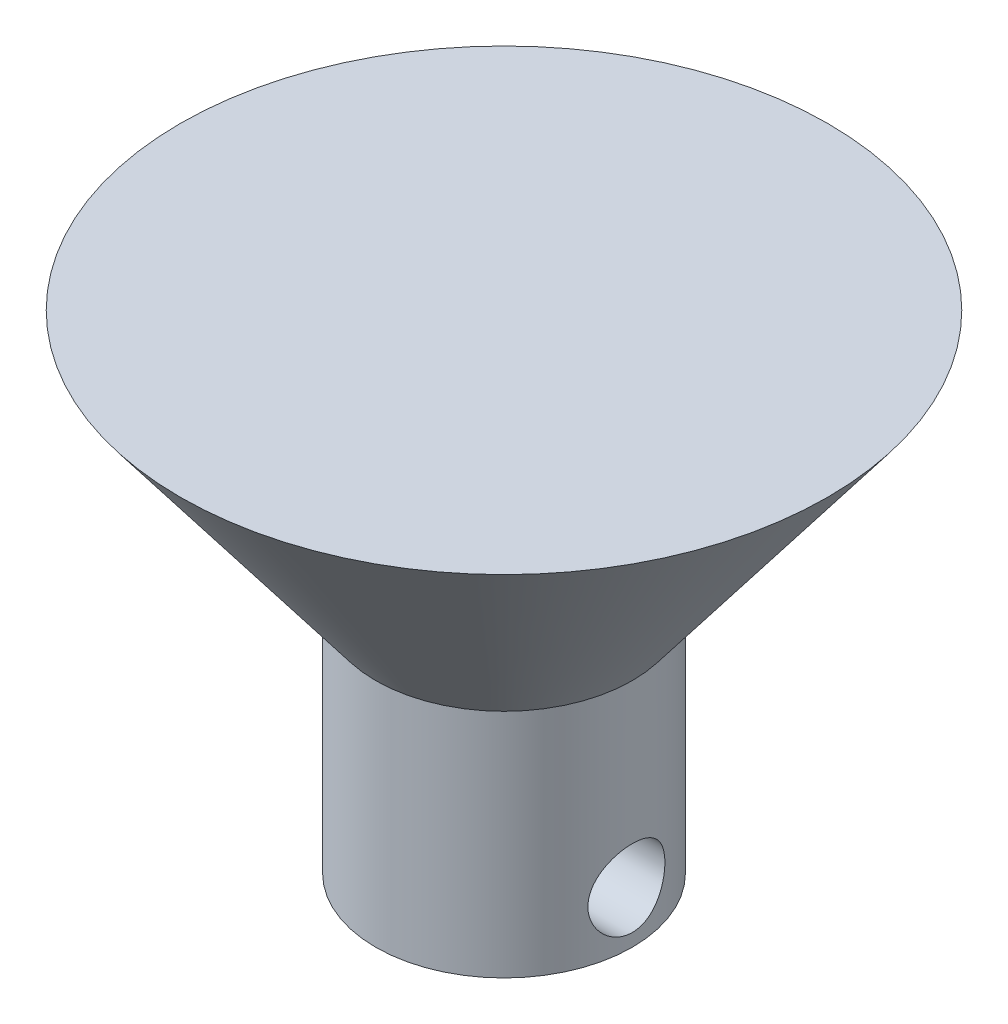
ISO-10303-21;
HEADER;
FILE_DESCRIPTION(('STEP AP214'),'2;1');
FILE_NAME('part.step','',(''),(''),'','','');
FILE_SCHEMA(('AUTOMOTIVE_DESIGN { 1 0 10303 214 1 1 1 1 }'));
ENDSEC;
DATA;
#1=APPLICATION_CONTEXT('core data for automotive mechanical design processes');
#2=APPLICATION_PROTOCOL_DEFINITION('international standard','automotive_design',2000,#1);
#3=PRODUCT_CONTEXT('',#1,'mechanical');
#4=PRODUCT('Part','Part','',(#3));
#5=PRODUCT_RELATED_PRODUCT_CATEGORY('part','',(#4));
#6=PRODUCT_DEFINITION_FORMATION('','',#4);
#7=PRODUCT_DEFINITION_CONTEXT('part definition',#1,'design');
#8=PRODUCT_DEFINITION('design','',#6,#7);
#9=PRODUCT_DEFINITION_SHAPE('','',#8);
#10=(LENGTH_UNIT() NAMED_UNIT(*) SI_UNIT(.MILLI.,.METRE.));
#11=(NAMED_UNIT(*) PLANE_ANGLE_UNIT() SI_UNIT($,.RADIAN.));
#12=(NAMED_UNIT(*) SI_UNIT($,.STERADIAN.) SOLID_ANGLE_UNIT());
#13=UNCERTAINTY_MEASURE_WITH_UNIT(LENGTH_MEASURE(1.E-05),#10,'distance_accuracy_value','');
#14=(GEOMETRIC_REPRESENTATION_CONTEXT(3) GLOBAL_UNCERTAINTY_ASSIGNED_CONTEXT((#13)) GLOBAL_UNIT_ASSIGNED_CONTEXT((#10,
#11,#12)) REPRESENTATION_CONTEXT('',''));
#15=CARTESIAN_POINT('',(0.,0.,0.));
#16=DIRECTION('',(0.,0.,1.));
#17=DIRECTION('',(1.,0.,0.));
#18=AXIS2_PLACEMENT_3D('',#15,#16,#17);
#19=CARTESIAN_POINT('',(0.,9.,0.));
#20=DIRECTION('',(0.,-1.,0.));
#21=DIRECTION('',(0.,0.,-1.));
#22=AXIS2_PLACEMENT_3D('',#19,#20,#21);
#23=CYLINDRICAL_SURFACE('',#22,5.);
#24=CARTESIAN_POINT('',(-5.,0.5,0.));
#25=CARTESIAN_POINT('',(-4.9999992925055,0.500000997484886,-0.0822886127533));
#26=CARTESIAN_POINT('',(-4.99794915693954,0.506793863623966,-0.164587318351529));
#27=CARTESIAN_POINT('',(-4.98997105593691,0.533721354222101,-0.326788125304881));
#28=CARTESIAN_POINT('',(-4.98404193389692,0.553859958023342,-0.40668950441142));
#29=CARTESIAN_POINT('',(-4.96895552501836,0.606746016910264,-0.561732707754527));
#30=CARTESIAN_POINT('',(-4.95980300250425,0.639474869618937,-0.636881364395373));
#31=CARTESIAN_POINT('',(-4.93922109237645,0.716536093055836,-0.780624181053131));
#32=CARTESIAN_POINT('',(-4.92779140192067,0.760870007395417,-0.84921746746967));
#33=CARTESIAN_POINT('',(-4.90350737192774,0.861224007472669,-0.979871797183745));
#34=CARTESIAN_POINT('',(-4.89062383657036,0.917516625885914,-1.04171807124434));
#35=CARTESIAN_POINT('',(-4.86505834210442,1.03960922991018,-1.15524920923324));
#36=CARTESIAN_POINT('',(-4.85237641724501,1.10541081212496,-1.20693236327441));
#37=CARTESIAN_POINT('',(-4.82834113993772,1.24647075303761,-1.29980037723708));
#38=CARTESIAN_POINT('',(-4.81702406663875,1.32190846099074,-1.34072309022213));
#39=CARTESIAN_POINT('',(-4.79743620394031,1.47898925423029,-1.4092139477476));
#40=CARTESIAN_POINT('',(-4.78916468313311,1.56063084392798,-1.43678529919973));
#41=CARTESIAN_POINT('',(-4.77690870838434,1.72539026613046,-1.47701633682652));
#42=CARTESIAN_POINT('',(-4.77281069324533,1.80840274386394,-1.49007196234677));
#43=CARTESIAN_POINT('',(-4.76902789749767,1.97553315621677,-1.50213730614672));
#44=CARTESIAN_POINT('',(-4.76934204760571,2.05965081805909,-1.50115042761078));
#45=CARTESIAN_POINT('',(-4.77424744067778,2.22338390860848,-1.48546977199812));
#46=CARTESIAN_POINT('',(-4.7786838859914,2.30305225036224,-1.47127205262685));
#47=CARTESIAN_POINT('',(-4.79108356228624,2.45881978627346,-1.43037420427056));
#48=CARTESIAN_POINT('',(-4.79904714132351,2.53491862737433,-1.40367284141641));
#49=CARTESIAN_POINT('',(-4.81772733074973,2.68260034966074,-1.33816026653682));
#50=CARTESIAN_POINT('',(-4.82848016115952,2.75410708395526,-1.29918816934642));
#51=CARTESIAN_POINT('',(-4.85150987000065,2.88973202201019,-1.21035222588683));
#52=CARTESIAN_POINT('',(-4.86378711746991,2.95384842941378,-1.16048574002588));
#53=CARTESIAN_POINT('',(-4.88911011297937,3.07568619076202,-1.04881290765546));
#54=CARTESIAN_POINT('',(-4.90216654310498,3.13302866402967,-0.986594907466972));
#55=CARTESIAN_POINT('',(-4.92712244063259,3.23655398406425,-0.853263259313967));
#56=CARTESIAN_POINT('',(-4.9390218351841,3.28273612841443,-0.782149051860888));
#57=CARTESIAN_POINT('',(-4.9604316006947,3.36285992246473,-0.632355038342803));
#58=CARTESIAN_POINT('',(-4.96992543668314,3.39671751624986,-0.55362774974795));
#59=CARTESIAN_POINT('',(-4.98533521832222,3.45059959009963,-0.39124541560352));
#60=CARTESIAN_POINT('',(-4.99125216186999,3.47062792853249,-0.307591751589582));
#61=CARTESIAN_POINT('',(-4.99868364643538,3.49565217789939,-0.140952242668332));
#62=CARTESIAN_POINT('',(-5.0003485041779,3.50116158580161,-0.0580500976011871));
#63=CARTESIAN_POINT('',(-4.9995292324176,3.49843084428792,0.107499605823383));
#64=CARTESIAN_POINT('',(-4.99704565677756,3.49019253034856,0.19014719669078));
#65=CARTESIAN_POINT('',(-4.98830696987163,3.4606153888885,0.350903605309697));
#66=CARTESIAN_POINT('',(-4.98213829799417,3.43957661241913,0.429072772614169));
#67=CARTESIAN_POINT('',(-4.96674347841533,3.3853567672218,0.580754638954522));
#68=CARTESIAN_POINT('',(-4.95751696321085,3.35217423896214,0.654266777025583));
#69=CARTESIAN_POINT('',(-4.93669654351325,3.27374683451887,0.796437189461052));
#70=CARTESIAN_POINT('',(-4.92505280829675,3.22824065905203,0.864943826199669));
#71=CARTESIAN_POINT('',(-4.90073468764318,3.12677524594719,0.993523307980147));
#72=CARTESIAN_POINT('',(-4.8880600443108,3.07081338811233,1.05359403235593));
#73=CARTESIAN_POINT('',(-4.86253171869138,2.94761269163066,1.16585744551027));
#74=CARTESIAN_POINT('',(-4.84968825033268,2.88003812422826,1.21768481231503));
#75=CARTESIAN_POINT('',(-4.82576515238464,2.73687206098647,1.30928995072154));
#76=CARTESIAN_POINT('',(-4.81468547654651,2.66128077544179,1.34906803829472));
#77=CARTESIAN_POINT('',(-4.79567189615055,2.50446750874531,1.41517347127168));
#78=CARTESIAN_POINT('',(-4.78772337843827,2.42327381346341,1.4415634693705));
#79=CARTESIAN_POINT('',(-4.77591594362794,2.25731203106852,1.48021730815114));
#80=CARTESIAN_POINT('',(-4.772055625083,2.17254517921233,1.49248598978779));
#81=CARTESIAN_POINT('',(-4.76899972496087,2.00563848162377,1.50221984485059));
#82=CARTESIAN_POINT('',(-4.76961647442754,1.92353634898242,1.5002805530849));
#83=CARTESIAN_POINT('',(-4.77499401288294,1.7608858966272,1.48307505444813));
#84=CARTESIAN_POINT('',(-4.77975463592551,1.68033751482365,1.46780938124716));
#85=CARTESIAN_POINT('',(-4.79275763670385,1.52405460085715,1.42476888804136));
#86=CARTESIAN_POINT('',(-4.80095604545965,1.44827271263831,1.39715175507068));
#87=CARTESIAN_POINT('',(-4.81990278909136,1.30235756118228,1.33031507121129));
#88=CARTESIAN_POINT('',(-4.83065161194312,1.23222538235924,1.29109329962876));
#89=CARTESIAN_POINT('',(-4.85397676425833,1.09683688347289,1.20048763805072));
#90=CARTESIAN_POINT('',(-4.86660540163798,1.03185123873959,1.14871276092994));
#91=CARTESIAN_POINT('',(-4.89201320450026,0.911297501692137,1.03517434629782));
#92=CARTESIAN_POINT('',(-4.90479240823905,0.855731860532243,0.973408217134502));
#93=CARTESIAN_POINT('',(-4.92950936570649,0.75397658770497,0.839465762183249));
#94=CARTESIAN_POINT('',(-4.94141159765674,0.708108553144511,0.767037885790608));
#95=CARTESIAN_POINT('',(-4.96260680455813,0.629264830095975,0.615141373983529));
#96=CARTESIAN_POINT('',(-4.97190099931067,0.596283111725492,0.535676052998955));
#97=CARTESIAN_POINT('',(-4.98602174969301,0.547104724347251,0.380757712655282));
#98=CARTESIAN_POINT('',(-4.99122027381068,0.529488327116752,0.305786961954234));
#99=CARTESIAN_POINT('',(-4.99820944494492,0.505936474758423,0.15388019523078));
#100=CARTESIAN_POINT('',(-5.0000006615474,0.499999067295181,0.0769445098581397));
#101=CARTESIAN_POINT('',(-5.,0.5,0.));
#102=B_SPLINE_CURVE_WITH_KNOTS('',3,(#24,#25,#26,#27,#28,#29,#30,#31,#32,#33,#34,#35,#36,#37,
#38,#39,#40,#41,#42,#43,#44,#45,#46,#47,#48,#49,#50,#51,#52,#53,#54,#55,#56,#57,#58,#59,#60,#61,
#62,#63,#64,#65,#66,#67,#68,#69,#70,#71,#72,#73,#74,#75,#76,#77,#78,#79,#80,#81,#82,#83,#84,#85,
#86,#87,#88,#89,#90,#91,#92,#93,#94,#95,#96,#97,#98,#99,#100,#101),.UNSPECIFIED.,.T.,.F.,(4,2,2,
2,2,2,2,2,2,2,2,2,2,2,2,2,2,2,2,2,2,2,2,2,2,2,2,2,2,2,2,2,2,2,2,2,2,2,4),(0.,0.246583203612611,
0.493239964846,0.739533676300874,0.985860164412702,1.23855602948191,1.49129437288633,
1.74971481004109,2.00807314543224,2.25919689356599,2.51025978319089,2.75226016697676,
2.99428443658001,3.23962426447119,3.48502360158555,3.74067104048166,3.99633456531071,
4.25371046881688,4.51101453528808,4.75908809438545,5.00712853550327,5.24956746682327,
5.49203554593728,5.74011305702908,5.98825282000191,6.24540400322818,6.5025484425268,
6.75847814951252,7.01432009460283,7.25950155466943,7.504673196616,7.74680040402721,
7.98897397553107,8.23996925679931,8.49102974897502,8.74942996156671,9.00770911595235,
9.23831691930459,9.46888616948874),.UNSPECIFIED.);
#103=CARTESIAN_POINT('',(-5.,0.5,0.));
#104=VERTEX_POINT('',#103);
#105=EDGE_CURVE('E11',#104,#104,#102,.T.);
#106=ORIENTED_EDGE('',*,*,#105,.T.);
#107=EDGE_LOOP('',(#106));
#108=FACE_BOUND('',#107,.T.);
#109=CARTESIAN_POINT('',(4.76969600708473,2.,-1.5));
#110=CARTESIAN_POINT('',(4.7696968572698,1.9178054520576,-1.49999897633764));
#111=CARTESIAN_POINT('',(4.77184390209069,1.83560077585598,-1.49322108167142));
#112=CARTESIAN_POINT('',(4.780165783029,1.67359475040806,-1.46635844446749));
#113=CARTESIAN_POINT('',(4.78634196493468,1.59379421349853,-1.44626925573578));
#114=CARTESIAN_POINT('',(4.80196102485632,1.43896527172827,-1.39352753269955));
#115=CARTESIAN_POINT('',(4.81139846703232,1.36392917036691,-1.36089589394243));
#116=CARTESIAN_POINT('',(4.83246932547567,1.2203780660047,-1.28406421917929));
#117=CARTESIAN_POINT('',(4.84410307041019,1.15186404131556,-1.23986245137053));
#118=CARTESIAN_POINT('',(4.86866862185765,1.02113360942262,-1.13964754141627));
#119=CARTESIAN_POINT('',(4.88162808311636,0.959154102053713,-1.08333207175807));
#120=CARTESIAN_POINT('',(4.90714861936757,0.845362048677491,-0.961136237579599));
#121=CARTESIAN_POINT('',(4.91970964297705,0.793550809550121,-0.895254645461111));
#122=CARTESIAN_POINT('',(4.94333214579389,0.700537300166693,-0.75411143779369));
#123=CARTESIAN_POINT('',(4.95435724342404,0.659576575557191,-0.678684021335815));
#124=CARTESIAN_POINT('',(4.97334435920684,0.591012740957243,-0.521624645369354));
#125=CARTESIAN_POINT('',(4.98130703789495,0.563406750142551,-0.439994028387912));
#126=CARTESIAN_POINT('',(4.99307646003589,0.523119998909491,-0.27532385263083));
#127=CARTESIAN_POINT('',(4.99699557369338,0.510034872347297,-0.192391398953801));
#128=CARTESIAN_POINT('',(5.00063201501348,0.497882675353559,-0.025421823749315));
#129=CARTESIAN_POINT('',(5.00035022521079,0.498812660598037,0.0586150620503682));
#130=CARTESIAN_POINT('',(4.99569603817659,0.514392868543023,0.22257115660016));
#131=CARTESIAN_POINT('',(4.9914542020526,0.528605193809869,0.302536267641341));
#132=CARTESIAN_POINT('',(4.97951522112593,0.56963133599429,0.458889213442527));
#133=CARTESIAN_POINT('',(4.97181785750586,0.596445950942671,0.535276821322846));
#134=CARTESIAN_POINT('',(4.95365220986963,0.662212023418558,0.683347326351281));
#135=CARTESIAN_POINT('',(4.94315269676706,0.701301202807267,0.754965064694478));
#136=CARTESIAN_POINT('',(4.92049640648069,0.790397852428228,0.890764673783156));
#137=CARTESIAN_POINT('',(4.90833923637778,0.840407912963484,0.954944774872131));
#138=CARTESIAN_POINT('',(4.88311550488165,0.952197750751597,1.0766604815298));
#139=CARTESIAN_POINT('',(4.87003195321461,1.01435691902974,1.13384458040111));
#140=CARTESIAN_POINT('',(4.84483979887497,1.14751001789005,1.23707651539824));
#141=CARTESIAN_POINT('',(4.8327312931702,1.21850482538923,1.28312324482853));
#142=CARTESIAN_POINT('',(4.81077903197678,1.36823946924899,1.3631399533545));
#143=CARTESIAN_POINT('',(4.80095810695957,1.44704704586292,1.39698989237679));
#144=CARTESIAN_POINT('',(4.78496392548436,1.60960720844554,1.45083362878413));
#145=CARTESIAN_POINT('',(4.7787894791583,1.69335817153456,1.4708319464056));
#146=CARTESIAN_POINT('',(4.77104849541241,1.86008236073928,1.49574770282165));
#147=CARTESIAN_POINT('',(4.7693187867044,1.94296822389398,1.50119946380212));
#148=CARTESIAN_POINT('',(4.77021192441924,2.10847290000987,1.49835947233062));
#149=CARTESIAN_POINT('',(4.77283416156589,2.19109174873085,1.4900696437133));
#150=CARTESIAN_POINT('',(4.78197558554912,2.35148837797087,1.4604576357419));
#151=CARTESIAN_POINT('',(4.78839176507489,2.42933616426352,1.4394796143128));
#152=CARTESIAN_POINT('',(4.80429141231227,2.58040169081492,1.3854857774794));
#153=CARTESIAN_POINT('',(4.81377535359073,2.65361871414057,1.3524681034276));
#154=CARTESIAN_POINT('',(4.83505835023047,2.79551746407213,1.274318711965));
#155=CARTESIAN_POINT('',(4.84691271069799,2.86402472098579,1.22888564172729));
#156=CARTESIAN_POINT('',(4.87148205646987,2.9926381061808,1.12755301600385));
#157=CARTESIAN_POINT('',(4.88419724730003,3.05274221761279,1.07165095534897));
#158=CARTESIAN_POINT('',(4.90963633548158,3.16518040581474,0.948455132493599));
#159=CARTESIAN_POINT('',(4.92234245063004,3.21713562898698,0.880811065857434));
#160=CARTESIAN_POINT('',(4.94584851748651,3.30896670102775,0.737461784590249));
#161=CARTESIAN_POINT('',(4.95664856384717,3.34884314978146,0.661756970543944));
#162=CARTESIAN_POINT('',(4.97505970474957,3.4150000305683,0.504935504705222));
#163=CARTESIAN_POINT('',(4.98269453424966,3.44138201615898,0.423864622037839));
#164=CARTESIAN_POINT('',(4.99401979596827,3.48006091889042,0.258169966504588));
#165=CARTESIAN_POINT('',(4.9977113567088,3.49236186594842,0.173547217354763));
#166=CARTESIAN_POINT('',(5.00066544081399,3.5022230440545,0.00665215388274265));
#167=CARTESIAN_POINT('',(5.00009305111322,3.50033269540783,-0.0755851790862068));
#168=CARTESIAN_POINT('',(4.99497264465037,3.48317836750088,-0.238519481164404));
#169=CARTESIAN_POINT('',(4.99042485330462,3.46791514651956,-0.319216537346529));
#170=CARTESIAN_POINT('',(4.97791168358327,3.42478833860038,-0.475935813041358));
#171=CARTESIAN_POINT('',(4.96998352900866,3.39706181935099,-0.551998927351392));
#172=CARTESIAN_POINT('',(4.9515294303945,3.32991808549281,-0.698433237752053));
#173=CARTESIAN_POINT('',(4.94100305949946,3.29049894971381,-0.76880349605058));
#174=CARTESIAN_POINT('',(4.91803965828228,3.19962654256996,-0.904301892420563));
#175=CARTESIAN_POINT('',(4.90555226923559,3.14782856999923,-0.969190250076767));
#176=CARTESIAN_POINT('',(4.88023537212334,3.0342896116672,-1.08953757134594));
#177=CARTESIAN_POINT('',(4.86740576641079,2.97254576210185,-1.14499380960194));
#178=CARTESIAN_POINT('',(4.84240680631319,2.83865922168949,-1.24656269394549));
#179=CARTESIAN_POINT('',(4.83026852693485,2.76626144660956,-1.29234759757956));
#180=CARTESIAN_POINT('',(4.80852547508793,2.61444482583898,-1.37104313528776));
#181=CARTESIAN_POINT('',(4.79891948596956,2.53502937639881,-1.40395995557289));
#182=CARTESIAN_POINT('',(4.78427816717594,2.38025956839373,-1.4530194253295));
#183=CARTESIAN_POINT('',(4.7788615484052,2.30539135306901,-1.47058859011232));
#184=CARTESIAN_POINT('',(4.77157042597167,2.15368477750423,-1.49407818835144));
#185=CARTESIAN_POINT('',(4.7696952122143,2.07684681535475,-1.50000095706095));
#186=CARTESIAN_POINT('',(4.76969600708473,2.,-1.5));
#187=B_SPLINE_CURVE_WITH_KNOTS('',3,(#109,#110,#111,#112,#113,#114,#115,#116,#117,#118,#119,
#120,#121,#122,#123,#124,#125,#126,#127,#128,#129,#130,#131,#132,#133,#134,#135,#136,#137,#138,
#139,#140,#141,#142,#143,#144,#145,#146,#147,#148,#149,#150,#151,#152,#153,#154,#155,#156,#157,
#158,#159,#160,#161,#162,#163,#164,#165,#166,#167,#168,#169,#170,#171,#172,#173,#174,#175,#176,
#177,#178,#179,#180,#181,#182,#183,#184,#185,#186),.UNSPECIFIED.,.T.,.F.,(4,2,2,2,2,2,2,2,2,2,2,
2,2,2,2,2,2,2,2,2,2,2,2,2,2,2,2,2,2,2,2,2,2,2,2,2,2,2,4),(0.,0.246300165915542,0.492682641689,
0.738656414466193,0.984667025370101,1.23773150007984,1.49082847871273,1.74915939273645,
2.00743455587877,2.25832140149558,2.5091555410144,2.7520012599088,2.99486235890376,
3.24055209335676,3.4863001659083,3.74152147023278,3.99676812491863,4.25446238246266,
4.51207250628411,4.76008080790309,5.00805439107388,5.24958594938817,5.49115481045787,
5.73920731809388,5.98731925928923,6.24479506100602,6.50225807324202,6.75775391814325,
7.01317662321682,7.2587630391122,7.50433553047755,7.74727096872219,7.99024634491378,
8.24099627054488,8.4918185262989,8.75011639669147,9.00828993963944,9.23861153857447,
9.4688869503356),.UNSPECIFIED.);
#188=CARTESIAN_POINT('',(4.76969600708473,2.,-1.5));
#189=VERTEX_POINT('',#188);
#190=EDGE_CURVE('E40',#189,#189,#187,.T.);
#191=ORIENTED_EDGE('',*,*,#190,.T.);
#192=EDGE_LOOP('',(#191));
#193=FACE_BOUND('',#192,.T.);
#194=CARTESIAN_POINT('',(0.,9.,0.));
#195=DIRECTION('',(0.,1.,0.));
#196=DIRECTION('',(0.,0.,1.));
#197=AXIS2_PLACEMENT_3D('',#194,#195,#196);
#198=CIRCLE('',#197,5.);
#199=CARTESIAN_POINT('',(0.,9.,5.));
#200=VERTEX_POINT('',#199);
#201=EDGE_CURVE('E45',#200,#200,#198,.T.);
#202=ORIENTED_EDGE('',*,*,#201,.F.);
#203=EDGE_LOOP('',(#202));
#204=FACE_BOUND('',#203,.T.);
#205=CARTESIAN_POINT('',(0.,0.,0.));
#206=DIRECTION('',(0.,1.,0.));
#207=DIRECTION('',(0.,0.,1.));
#208=AXIS2_PLACEMENT_3D('',#205,#206,#207);
#209=CIRCLE('',#208,5.);
#210=CARTESIAN_POINT('',(0.,0.,5.));
#211=VERTEX_POINT('',#210);
#212=EDGE_CURVE('E71',#211,#211,#209,.T.);
#213=ORIENTED_EDGE('',*,*,#212,.T.);
#214=EDGE_LOOP('',(#213));
#215=FACE_BOUND('',#214,.T.);
#216=ADVANCED_FACE('F32',(#108,#193,#204,#215),#23,.T.);
#217=CARTESIAN_POINT('',(0.,0.,0.));
#218=DIRECTION('',(0.,1.,0.));
#219=DIRECTION('',(0.,0.,1.));
#220=AXIS2_PLACEMENT_3D('',#217,#218,#219);
#221=PLANE('',#220);
#222=ORIENTED_EDGE('',*,*,#212,.F.);
#223=EDGE_LOOP('',(#222));
#224=FACE_BOUND('',#223,.T.);
#225=ADVANCED_FACE('F58',(#224),#221,.F.);
#226=CARTESIAN_POINT('',(-5.,2.,0.));
#227=DIRECTION('',(1.,0.,0.));
#228=DIRECTION('',(0.,0.,-1.));
#229=AXIS2_PLACEMENT_3D('',#226,#227,#228);
#230=CYLINDRICAL_SURFACE('',#229,1.5);
#231=ORIENTED_EDGE('',*,*,#190,.F.);
#232=EDGE_LOOP('',(#231));
#233=FACE_BOUND('',#232,.T.);
#234=ORIENTED_EDGE('',*,*,#105,.F.);
#235=EDGE_LOOP('',(#234));
#236=FACE_BOUND('',#235,.T.);
#237=ADVANCED_FACE('F53',(#233,#236),#230,.F.);
#238=CARTESIAN_POINT('',(0.,19.,0.));
#239=DIRECTION('',(0.,1.,0.));
#240=DIRECTION('',(0.,0.,1.));
#241=AXIS2_PLACEMENT_3D('',#238,#239,#240);
#242=PLANE('',#241);
#243=CARTESIAN_POINT('',(0.,19.,0.));
#244=DIRECTION('',(0.,1.,0.));
#245=DIRECTION('',(0.,0.,1.));
#246=AXIS2_PLACEMENT_3D('',#243,#244,#245);
#247=CIRCLE('',#246,12.616);
#248=CARTESIAN_POINT('',(0.,19.,12.616));
#249=VERTEX_POINT('',#248);
#250=EDGE_CURVE('E73',#249,#249,#247,.T.);
#251=ORIENTED_EDGE('',*,*,#250,.T.);
#252=EDGE_LOOP('',(#251));
#253=FACE_BOUND('',#252,.T.);
#254=ADVANCED_FACE('F57',(#253),#242,.T.);
#255=CARTESIAN_POINT('',(0.,9.,0.));
#256=DIRECTION('',(0.,1.,0.));
#257=DIRECTION('',(0.,0.,1.));
#258=AXIS2_PLACEMENT_3D('',#255,#256,#257);
#259=CONICAL_SURFACE('',#258,5.,0.650883866714698);
#260=ORIENTED_EDGE('',*,*,#250,.F.);
#261=EDGE_LOOP('',(#260));
#262=FACE_BOUND('',#261,.T.);
#263=ORIENTED_EDGE('',*,*,#201,.T.);
#264=EDGE_LOOP('',(#263));
#265=FACE_BOUND('',#264,.T.);
#266=ADVANCED_FACE('F60',(#262,#265),#259,.T.);
#267=CLOSED_SHELL('',(#216,#225,#237,#254,#266));
#268=MANIFOLD_SOLID_BREP('B2',#267);
#269=ADVANCED_BREP_SHAPE_REPRESENTATION('',(#18,#268),#14);
#270=SHAPE_DEFINITION_REPRESENTATION(#9,#269);
ENDSEC;
END-ISO-10303-21;
